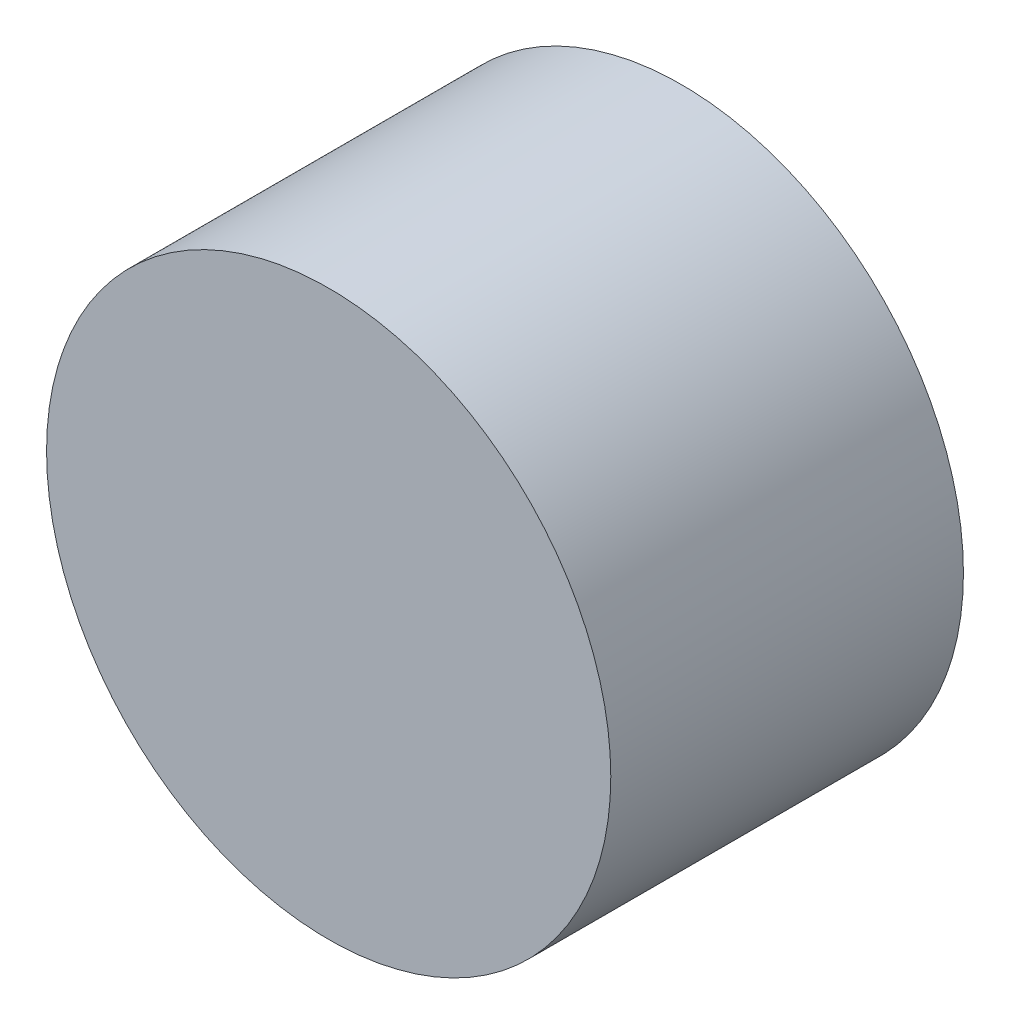
ISO-10303-21;
HEADER;
FILE_DESCRIPTION(('STEP AP214'),'2;1');
FILE_NAME('part.step','',(''),(''),'','','');
FILE_SCHEMA(('AUTOMOTIVE_DESIGN { 1 0 10303 214 1 1 1 1 }'));
ENDSEC;
DATA;
#1=APPLICATION_CONTEXT('core data for automotive mechanical design processes');
#2=APPLICATION_PROTOCOL_DEFINITION('international standard','automotive_design',2000,#1);
#3=PRODUCT_CONTEXT('',#1,'mechanical');
#4=PRODUCT('Part','Part','',(#3));
#5=PRODUCT_RELATED_PRODUCT_CATEGORY('part','',(#4));
#6=PRODUCT_DEFINITION_FORMATION('','',#4);
#7=PRODUCT_DEFINITION_CONTEXT('part definition',#1,'design');
#8=PRODUCT_DEFINITION('design','',#6,#7);
#9=PRODUCT_DEFINITION_SHAPE('','',#8);
#10=(LENGTH_UNIT() NAMED_UNIT(*) SI_UNIT(.MILLI.,.METRE.));
#11=(NAMED_UNIT(*) PLANE_ANGLE_UNIT() SI_UNIT($,.RADIAN.));
#12=(NAMED_UNIT(*) SI_UNIT($,.STERADIAN.) SOLID_ANGLE_UNIT());
#13=UNCERTAINTY_MEASURE_WITH_UNIT(LENGTH_MEASURE(1.E-05),#10,'distance_accuracy_value','');
#14=(GEOMETRIC_REPRESENTATION_CONTEXT(3) GLOBAL_UNCERTAINTY_ASSIGNED_CONTEXT((#13)) GLOBAL_UNIT_ASSIGNED_CONTEXT((#10,
#11,#12)) REPRESENTATION_CONTEXT('',''));
#15=CARTESIAN_POINT('',(0.,0.,0.));
#16=DIRECTION('',(0.,0.,1.));
#17=DIRECTION('',(1.,0.,0.));
#18=AXIS2_PLACEMENT_3D('',#15,#16,#17);
#19=CARTESIAN_POINT('',(0.,0.,0.));
#20=DIRECTION('',(0.,0.,1.));
#21=DIRECTION('',(1.,0.,0.));
#22=AXIS2_PLACEMENT_3D('',#19,#20,#21);
#23=PLANE('',#22);
#24=CARTESIAN_POINT('',(0.,0.,0.));
#25=DIRECTION('',(0.,0.,1.));
#26=DIRECTION('',(1.,0.,0.));
#27=AXIS2_PLACEMENT_3D('',#24,#25,#26);
#28=CIRCLE('',#27,20.);
#29=CARTESIAN_POINT('',(20.,0.,0.));
#30=VERTEX_POINT('',#29);
#31=EDGE_CURVE('E10',#30,#30,#28,.T.);
#32=ORIENTED_EDGE('',*,*,#31,.F.);
#33=EDGE_LOOP('',(#32));
#34=FACE_BOUND('',#33,.T.);
#35=CARTESIAN_POINT('',(0.,15.,0.));
#36=DIRECTION('',(0.,0.,1.));
#37=DIRECTION('',(1.,0.,0.));
#38=AXIS2_PLACEMENT_3D('',#35,#36,#37);
#39=CIRCLE('',#38,2.5);
#40=CARTESIAN_POINT('',(2.5,15.,0.));
#41=VERTEX_POINT('',#40);
#42=EDGE_CURVE('E48',#41,#41,#39,.T.);
#43=ORIENTED_EDGE('',*,*,#42,.T.);
#44=EDGE_LOOP('',(#43));
#45=FACE_BOUND('',#44,.T.);
#46=CARTESIAN_POINT('',(0.,5.,0.));
#47=DIRECTION('',(0.,0.,1.));
#48=DIRECTION('',(1.,0.,0.));
#49=AXIS2_PLACEMENT_3D('',#46,#47,#48);
#50=CIRCLE('',#49,2.5);
#51=CARTESIAN_POINT('',(2.5,5.,0.));
#52=VERTEX_POINT('',#51);
#53=EDGE_CURVE('E53',#52,#52,#50,.T.);
#54=ORIENTED_EDGE('',*,*,#53,.T.);
#55=EDGE_LOOP('',(#54));
#56=FACE_BOUND('',#55,.T.);
#57=CARTESIAN_POINT('',(10.6066017177984,10.6066017177987,0.));
#58=DIRECTION('',(0.,0.,1.));
#59=DIRECTION('',(1.,0.,0.));
#60=AXIS2_PLACEMENT_3D('',#57,#58,#59);
#61=CIRCLE('',#60,2.50000000000007);
#62=CARTESIAN_POINT('',(13.1066017177985,10.6066017177987,0.));
#63=VERTEX_POINT('',#62);
#64=EDGE_CURVE('E58',#63,#63,#61,.T.);
#65=ORIENTED_EDGE('',*,*,#64,.T.);
#66=EDGE_LOOP('',(#65));
#67=FACE_BOUND('',#66,.T.);
#68=CARTESIAN_POINT('',(15.0000000000006,6.37821527513228E-13,0.));
#69=DIRECTION('',(0.,0.,1.));
#70=DIRECTION('',(1.,0.,0.));
#71=AXIS2_PLACEMENT_3D('',#68,#69,#70);
#72=CIRCLE('',#71,2.50000000000047);
#73=CARTESIAN_POINT('',(17.5000000000011,6.37821527513228E-13,0.));
#74=VERTEX_POINT('',#73);
#75=EDGE_CURVE('E74',#74,#74,#72,.T.);
#76=ORIENTED_EDGE('',*,*,#75,.T.);
#77=EDGE_LOOP('',(#76));
#78=FACE_BOUND('',#77,.T.);
#79=CARTESIAN_POINT('',(10.6066017177993,-10.6066017177978,0.));
#80=DIRECTION('',(0.,0.,1.));
#81=DIRECTION('',(1.,0.,0.));
#82=AXIS2_PLACEMENT_3D('',#79,#80,#81);
#83=CIRCLE('',#82,2.50000000000098);
#84=CARTESIAN_POINT('',(13.1066017178003,-10.6066017177978,0.));
#85=VERTEX_POINT('',#84);
#86=EDGE_CURVE('E82',#85,#85,#83,.T.);
#87=ORIENTED_EDGE('',*,*,#86,.T.);
#88=EDGE_LOOP('',(#87));
#89=FACE_BOUND('',#88,.T.);
#90=CARTESIAN_POINT('',(1.27564305502646E-12,-15.,0.));
#91=DIRECTION('',(0.,0.,1.));
#92=DIRECTION('',(1.,0.,0.));
#93=AXIS2_PLACEMENT_3D('',#90,#91,#92);
#94=CIRCLE('',#93,2.50000000000132);
#95=CARTESIAN_POINT('',(2.50000000000259,-15.,0.));
#96=VERTEX_POINT('',#95);
#97=EDGE_CURVE('E90',#96,#96,#94,.T.);
#98=ORIENTED_EDGE('',*,*,#97,.T.);
#99=EDGE_LOOP('',(#98));
#100=FACE_BOUND('',#99,.T.);
#101=CARTESIAN_POINT('',(-10.6066017177971,-10.6066017177987,0.));
#102=DIRECTION('',(0.,0.,1.));
#103=DIRECTION('',(1.,0.,0.));
#104=AXIS2_PLACEMENT_3D('',#101,#102,#103);
#105=CIRCLE('',#104,2.5000000000013);
#106=CARTESIAN_POINT('',(-8.10660171779582,-10.6066017177987,0.));
#107=VERTEX_POINT('',#106);
#108=EDGE_CURVE('E98',#107,#107,#105,.T.);
#109=ORIENTED_EDGE('',*,*,#108,.T.);
#110=EDGE_LOOP('',(#109));
#111=FACE_BOUND('',#110,.T.);
#112=CARTESIAN_POINT('',(-14.9999999999994,-6.39658497711949E-13,0.));
#113=DIRECTION('',(0.,0.,1.));
#114=DIRECTION('',(1.,0.,0.));
#115=AXIS2_PLACEMENT_3D('',#112,#113,#114);
#116=CIRCLE('',#115,2.50000000000095);
#117=CARTESIAN_POINT('',(-12.4999999999984,-6.39658497711949E-13,0.));
#118=VERTEX_POINT('',#117);
#119=EDGE_CURVE('E106',#118,#118,#116,.T.);
#120=ORIENTED_EDGE('',*,*,#119,.T.);
#121=EDGE_LOOP('',(#120));
#122=FACE_BOUND('',#121,.T.);
#123=CARTESIAN_POINT('',(-10.606601717798,10.6066017177978,0.));
#124=DIRECTION('',(0.,0.,1.));
#125=DIRECTION('',(1.,0.,0.));
#126=AXIS2_PLACEMENT_3D('',#123,#124,#125);
#127=CIRCLE('',#126,2.50000000000049);
#128=CARTESIAN_POINT('',(-8.10660171779754,10.6066017177978,0.));
#129=VERTEX_POINT('',#128);
#130=EDGE_CURVE('E114',#129,#129,#127,.T.);
#131=ORIENTED_EDGE('',*,*,#130,.T.);
#132=EDGE_LOOP('',(#131));
#133=FACE_BOUND('',#132,.T.);
#134=CARTESIAN_POINT('',(5.,0.,0.));
#135=DIRECTION('',(0.,0.,1.));
#136=DIRECTION('',(1.,0.,0.));
#137=AXIS2_PLACEMENT_3D('',#134,#135,#136);
#138=CIRCLE('',#137,2.5);
#139=CARTESIAN_POINT('',(7.5,0.,0.));
#140=VERTEX_POINT('',#139);
#141=EDGE_CURVE('E122',#140,#140,#138,.T.);
#142=ORIENTED_EDGE('',*,*,#141,.T.);
#143=EDGE_LOOP('',(#142));
#144=FACE_BOUND('',#143,.T.);
#145=CARTESIAN_POINT('',(0.,-5.,0.));
#146=DIRECTION('',(0.,0.,1.));
#147=DIRECTION('',(1.,0.,0.));
#148=AXIS2_PLACEMENT_3D('',#145,#146,#147);
#149=CIRCLE('',#148,2.5);
#150=CARTESIAN_POINT('',(2.49999999999997,-5.,0.));
#151=VERTEX_POINT('',#150);
#152=EDGE_CURVE('E130',#151,#151,#149,.T.);
#153=ORIENTED_EDGE('',*,*,#152,.T.);
#154=EDGE_LOOP('',(#153));
#155=FACE_BOUND('',#154,.T.);
#156=CARTESIAN_POINT('',(-5.,0.,0.));
#157=DIRECTION('',(0.,0.,1.));
#158=DIRECTION('',(1.,0.,0.));
#159=AXIS2_PLACEMENT_3D('',#156,#157,#158);
#160=CIRCLE('',#159,2.5);
#161=CARTESIAN_POINT('',(-2.5,0.,0.));
#162=VERTEX_POINT('',#161);
#163=EDGE_CURVE('E138',#162,#162,#160,.T.);
#164=ORIENTED_EDGE('',*,*,#163,.T.);
#165=EDGE_LOOP('',(#164));
#166=FACE_BOUND('',#165,.T.);
#167=ADVANCED_FACE('F40',(#34,#45,#56,#67,#78,#89,#100,#111,#122,#133,#144,#155,#166),#23,.F.);
#168=CARTESIAN_POINT('',(0.,0.,10.));
#169=DIRECTION('',(0.,0.,-1.));
#170=DIRECTION('',(-1.,0.,0.));
#171=AXIS2_PLACEMENT_3D('',#168,#169,#170);
#172=CYLINDRICAL_SURFACE('',#171,20.);
#173=ORIENTED_EDGE('',*,*,#31,.T.);
#174=EDGE_LOOP('',(#173));
#175=FACE_BOUND('',#174,.T.);
#176=CARTESIAN_POINT('',(0.,0.,25.));
#177=DIRECTION('',(0.,0.,1.));
#178=DIRECTION('',(1.,0.,0.));
#179=AXIS2_PLACEMENT_3D('',#176,#177,#178);
#180=CIRCLE('',#179,20.);
#181=CARTESIAN_POINT('',(20.,0.,25.));
#182=VERTEX_POINT('',#181);
#183=EDGE_CURVE('E148',#182,#182,#180,.T.);
#184=ORIENTED_EDGE('',*,*,#183,.F.);
#185=EDGE_LOOP('',(#184));
#186=FACE_BOUND('',#185,.T.);
#187=ADVANCED_FACE('F42',(#175,#186),#172,.T.);
#188=CARTESIAN_POINT('',(0.,15.,10.));
#189=DIRECTION('',(0.,0.,-1.));
#190=DIRECTION('',(-1.,0.,0.));
#191=AXIS2_PLACEMENT_3D('',#188,#189,#190);
#192=CYLINDRICAL_SURFACE('',#191,2.5);
#193=CARTESIAN_POINT('',(0.,15.,10.));
#194=DIRECTION('',(0.,0.,1.));
#195=DIRECTION('',(1.,0.,0.));
#196=AXIS2_PLACEMENT_3D('',#193,#194,#195);
#197=CIRCLE('',#196,2.5);
#198=CARTESIAN_POINT('',(2.5,15.,10.));
#199=VERTEX_POINT('',#198);
#200=EDGE_CURVE('E61',#199,#199,#197,.T.);
#201=ORIENTED_EDGE('',*,*,#200,.T.);
#202=EDGE_LOOP('',(#201));
#203=FACE_BOUND('',#202,.T.);
#204=ORIENTED_EDGE('',*,*,#42,.F.);
#205=EDGE_LOOP('',(#204));
#206=FACE_BOUND('',#205,.T.);
#207=ADVANCED_FACE('F156',(#203,#206),#192,.F.);
#208=CARTESIAN_POINT('',(0.,5.,10.));
#209=DIRECTION('',(0.,0.,-1.));
#210=DIRECTION('',(-1.,0.,0.));
#211=AXIS2_PLACEMENT_3D('',#208,#209,#210);
#212=CYLINDRICAL_SURFACE('',#211,2.5);
#213=CARTESIAN_POINT('',(0.,5.,10.));
#214=DIRECTION('',(0.,0.,1.));
#215=DIRECTION('',(1.,0.,0.));
#216=AXIS2_PLACEMENT_3D('',#213,#214,#215);
#217=CIRCLE('',#216,2.5);
#218=CARTESIAN_POINT('',(2.5,5.,10.));
#219=VERTEX_POINT('',#218);
#220=EDGE_CURVE('E65',#219,#219,#217,.T.);
#221=ORIENTED_EDGE('',*,*,#220,.T.);
#222=EDGE_LOOP('',(#221));
#223=FACE_BOUND('',#222,.T.);
#224=ORIENTED_EDGE('',*,*,#53,.F.);
#225=EDGE_LOOP('',(#224));
#226=FACE_BOUND('',#225,.T.);
#227=ADVANCED_FACE('F162',(#223,#226),#212,.F.);
#228=CARTESIAN_POINT('',(10.6066017177984,10.6066017177987,10.));
#229=DIRECTION('',(0.,0.,-1.));
#230=DIRECTION('',(-1.,0.,0.));
#231=AXIS2_PLACEMENT_3D('',#228,#229,#230);
#232=CYLINDRICAL_SURFACE('',#231,2.50000000000007);
#233=CARTESIAN_POINT('',(10.6066017177984,10.6066017177987,10.));
#234=DIRECTION('',(0.,0.,1.));
#235=DIRECTION('',(1.,0.,0.));
#236=AXIS2_PLACEMENT_3D('',#233,#234,#235);
#237=CIRCLE('',#236,2.50000000000007);
#238=CARTESIAN_POINT('',(13.1066017177985,10.6066017177987,10.));
#239=VERTEX_POINT('',#238);
#240=EDGE_CURVE('E64',#239,#239,#237,.T.);
#241=ORIENTED_EDGE('',*,*,#240,.T.);
#242=EDGE_LOOP('',(#241));
#243=FACE_BOUND('',#242,.T.);
#244=ORIENTED_EDGE('',*,*,#64,.F.);
#245=EDGE_LOOP('',(#244));
#246=FACE_BOUND('',#245,.T.);
#247=ADVANCED_FACE('F172',(#243,#246),#232,.F.);
#248=CARTESIAN_POINT('',(15.0000000000006,6.37821527513228E-13,10.));
#249=DIRECTION('',(0.,0.,-1.));
#250=DIRECTION('',(-1.,0.,0.));
#251=AXIS2_PLACEMENT_3D('',#248,#249,#250);
#252=CYLINDRICAL_SURFACE('',#251,2.50000000000047);
#253=CARTESIAN_POINT('',(15.0000000000006,6.37821527513228E-13,10.));
#254=DIRECTION('',(0.,0.,1.));
#255=DIRECTION('',(1.,0.,0.));
#256=AXIS2_PLACEMENT_3D('',#253,#254,#255);
#257=CIRCLE('',#256,2.50000000000047);
#258=CARTESIAN_POINT('',(17.5000000000011,6.37821527513228E-13,10.));
#259=VERTEX_POINT('',#258);
#260=EDGE_CURVE('E70',#259,#259,#257,.T.);
#261=ORIENTED_EDGE('',*,*,#260,.T.);
#262=EDGE_LOOP('',(#261));
#263=FACE_BOUND('',#262,.T.);
#264=ORIENTED_EDGE('',*,*,#75,.F.);
#265=EDGE_LOOP('',(#264));
#266=FACE_BOUND('',#265,.T.);
#267=ADVANCED_FACE('F176',(#263,#266),#252,.F.);
#268=CARTESIAN_POINT('',(10.6066017177993,-10.6066017177978,10.));
#269=DIRECTION('',(0.,0.,-1.));
#270=DIRECTION('',(-1.,0.,0.));
#271=AXIS2_PLACEMENT_3D('',#268,#269,#270);
#272=CYLINDRICAL_SURFACE('',#271,2.50000000000098);
#273=CARTESIAN_POINT('',(10.6066017177993,-10.6066017177978,10.));
#274=DIRECTION('',(0.,0.,1.));
#275=DIRECTION('',(1.,0.,0.));
#276=AXIS2_PLACEMENT_3D('',#273,#274,#275);
#277=CIRCLE('',#276,2.50000000000098);
#278=CARTESIAN_POINT('',(13.1066017178003,-10.6066017177978,10.));
#279=VERTEX_POINT('',#278);
#280=EDGE_CURVE('E78',#279,#279,#277,.T.);
#281=ORIENTED_EDGE('',*,*,#280,.T.);
#282=EDGE_LOOP('',(#281));
#283=FACE_BOUND('',#282,.T.);
#284=ORIENTED_EDGE('',*,*,#86,.F.);
#285=EDGE_LOOP('',(#284));
#286=FACE_BOUND('',#285,.T.);
#287=ADVANCED_FACE('F180',(#283,#286),#272,.F.);
#288=CARTESIAN_POINT('',(1.27564305502646E-12,-15.,10.));
#289=DIRECTION('',(0.,0.,-1.));
#290=DIRECTION('',(-1.,0.,0.));
#291=AXIS2_PLACEMENT_3D('',#288,#289,#290);
#292=CYLINDRICAL_SURFACE('',#291,2.50000000000132);
#293=CARTESIAN_POINT('',(1.27564305502646E-12,-15.,10.));
#294=DIRECTION('',(0.,0.,1.));
#295=DIRECTION('',(1.,0.,0.));
#296=AXIS2_PLACEMENT_3D('',#293,#294,#295);
#297=CIRCLE('',#296,2.50000000000132);
#298=CARTESIAN_POINT('',(2.50000000000259,-15.,10.));
#299=VERTEX_POINT('',#298);
#300=EDGE_CURVE('E86',#299,#299,#297,.T.);
#301=ORIENTED_EDGE('',*,*,#300,.T.);
#302=EDGE_LOOP('',(#301));
#303=FACE_BOUND('',#302,.T.);
#304=ORIENTED_EDGE('',*,*,#97,.F.);
#305=EDGE_LOOP('',(#304));
#306=FACE_BOUND('',#305,.T.);
#307=ADVANCED_FACE('F184',(#303,#306),#292,.F.);
#308=CARTESIAN_POINT('',(-10.6066017177971,-10.6066017177987,10.));
#309=DIRECTION('',(0.,0.,-1.));
#310=DIRECTION('',(-1.,0.,0.));
#311=AXIS2_PLACEMENT_3D('',#308,#309,#310);
#312=CYLINDRICAL_SURFACE('',#311,2.5000000000013);
#313=CARTESIAN_POINT('',(-10.6066017177971,-10.6066017177987,10.));
#314=DIRECTION('',(0.,0.,1.));
#315=DIRECTION('',(1.,0.,0.));
#316=AXIS2_PLACEMENT_3D('',#313,#314,#315);
#317=CIRCLE('',#316,2.5000000000013);
#318=CARTESIAN_POINT('',(-8.10660171779582,-10.6066017177987,10.));
#319=VERTEX_POINT('',#318);
#320=EDGE_CURVE('E94',#319,#319,#317,.T.);
#321=ORIENTED_EDGE('',*,*,#320,.T.);
#322=EDGE_LOOP('',(#321));
#323=FACE_BOUND('',#322,.T.);
#324=ORIENTED_EDGE('',*,*,#108,.F.);
#325=EDGE_LOOP('',(#324));
#326=FACE_BOUND('',#325,.T.);
#327=ADVANCED_FACE('F188',(#323,#326),#312,.F.);
#328=CARTESIAN_POINT('',(-14.9999999999994,-6.39658497711949E-13,10.));
#329=DIRECTION('',(0.,0.,-1.));
#330=DIRECTION('',(-1.,0.,0.));
#331=AXIS2_PLACEMENT_3D('',#328,#329,#330);
#332=CYLINDRICAL_SURFACE('',#331,2.50000000000095);
#333=CARTESIAN_POINT('',(-14.9999999999994,-6.39658497711949E-13,10.));
#334=DIRECTION('',(0.,0.,1.));
#335=DIRECTION('',(1.,0.,0.));
#336=AXIS2_PLACEMENT_3D('',#333,#334,#335);
#337=CIRCLE('',#336,2.50000000000095);
#338=CARTESIAN_POINT('',(-12.4999999999984,-6.39658497711949E-13,10.));
#339=VERTEX_POINT('',#338);
#340=EDGE_CURVE('E102',#339,#339,#337,.T.);
#341=ORIENTED_EDGE('',*,*,#340,.T.);
#342=EDGE_LOOP('',(#341));
#343=FACE_BOUND('',#342,.T.);
#344=ORIENTED_EDGE('',*,*,#119,.F.);
#345=EDGE_LOOP('',(#344));
#346=FACE_BOUND('',#345,.T.);
#347=ADVANCED_FACE('F192',(#343,#346),#332,.F.);
#348=CARTESIAN_POINT('',(-10.606601717798,10.6066017177978,10.));
#349=DIRECTION('',(0.,0.,-1.));
#350=DIRECTION('',(-1.,0.,0.));
#351=AXIS2_PLACEMENT_3D('',#348,#349,#350);
#352=CYLINDRICAL_SURFACE('',#351,2.50000000000049);
#353=CARTESIAN_POINT('',(-10.606601717798,10.6066017177978,10.));
#354=DIRECTION('',(0.,0.,1.));
#355=DIRECTION('',(1.,0.,0.));
#356=AXIS2_PLACEMENT_3D('',#353,#354,#355);
#357=CIRCLE('',#356,2.50000000000049);
#358=CARTESIAN_POINT('',(-8.10660171779754,10.6066017177978,10.));
#359=VERTEX_POINT('',#358);
#360=EDGE_CURVE('E110',#359,#359,#357,.T.);
#361=ORIENTED_EDGE('',*,*,#360,.T.);
#362=EDGE_LOOP('',(#361));
#363=FACE_BOUND('',#362,.T.);
#364=ORIENTED_EDGE('',*,*,#130,.F.);
#365=EDGE_LOOP('',(#364));
#366=FACE_BOUND('',#365,.T.);
#367=ADVANCED_FACE('F196',(#363,#366),#352,.F.);
#368=CARTESIAN_POINT('',(5.,0.,10.));
#369=DIRECTION('',(0.,0.,-1.));
#370=DIRECTION('',(-1.,0.,0.));
#371=AXIS2_PLACEMENT_3D('',#368,#369,#370);
#372=CYLINDRICAL_SURFACE('',#371,2.5);
#373=CARTESIAN_POINT('',(5.,0.,10.));
#374=DIRECTION('',(0.,0.,1.));
#375=DIRECTION('',(1.,0.,0.));
#376=AXIS2_PLACEMENT_3D('',#373,#374,#375);
#377=CIRCLE('',#376,2.5);
#378=CARTESIAN_POINT('',(7.5,0.,10.));
#379=VERTEX_POINT('',#378);
#380=EDGE_CURVE('E118',#379,#379,#377,.T.);
#381=ORIENTED_EDGE('',*,*,#380,.T.);
#382=EDGE_LOOP('',(#381));
#383=FACE_BOUND('',#382,.T.);
#384=ORIENTED_EDGE('',*,*,#141,.F.);
#385=EDGE_LOOP('',(#384));
#386=FACE_BOUND('',#385,.T.);
#387=ADVANCED_FACE('F200',(#383,#386),#372,.F.);
#388=CARTESIAN_POINT('',(0.,-5.,10.));
#389=DIRECTION('',(0.,0.,-1.));
#390=DIRECTION('',(-1.,0.,0.));
#391=AXIS2_PLACEMENT_3D('',#388,#389,#390);
#392=CYLINDRICAL_SURFACE('',#391,2.5);
#393=CARTESIAN_POINT('',(0.,-5.,10.));
#394=DIRECTION('',(0.,0.,1.));
#395=DIRECTION('',(1.,0.,0.));
#396=AXIS2_PLACEMENT_3D('',#393,#394,#395);
#397=CIRCLE('',#396,2.5);
#398=CARTESIAN_POINT('',(2.49999999999997,-5.,10.));
#399=VERTEX_POINT('',#398);
#400=EDGE_CURVE('E126',#399,#399,#397,.T.);
#401=ORIENTED_EDGE('',*,*,#400,.T.);
#402=EDGE_LOOP('',(#401));
#403=FACE_BOUND('',#402,.T.);
#404=ORIENTED_EDGE('',*,*,#152,.F.);
#405=EDGE_LOOP('',(#404));
#406=FACE_BOUND('',#405,.T.);
#407=ADVANCED_FACE('F204',(#403,#406),#392,.F.);
#408=CARTESIAN_POINT('',(-5.,0.,10.));
#409=DIRECTION('',(0.,0.,-1.));
#410=DIRECTION('',(-1.,0.,0.));
#411=AXIS2_PLACEMENT_3D('',#408,#409,#410);
#412=CYLINDRICAL_SURFACE('',#411,2.5);
#413=CARTESIAN_POINT('',(-5.,0.,10.));
#414=DIRECTION('',(0.,0.,1.));
#415=DIRECTION('',(1.,0.,0.));
#416=AXIS2_PLACEMENT_3D('',#413,#414,#415);
#417=CIRCLE('',#416,2.5);
#418=CARTESIAN_POINT('',(-2.5,0.,10.));
#419=VERTEX_POINT('',#418);
#420=EDGE_CURVE('E134',#419,#419,#417,.T.);
#421=ORIENTED_EDGE('',*,*,#420,.T.);
#422=EDGE_LOOP('',(#421));
#423=FACE_BOUND('',#422,.T.);
#424=ORIENTED_EDGE('',*,*,#163,.F.);
#425=EDGE_LOOP('',(#424));
#426=FACE_BOUND('',#425,.T.);
#427=ADVANCED_FACE('F208',(#423,#426),#412,.F.);
#428=CARTESIAN_POINT('',(0.,0.,10.));
#429=DIRECTION('',(0.,0.,1.));
#430=DIRECTION('',(1.,0.,0.));
#431=AXIS2_PLACEMENT_3D('',#428,#429,#430);
#432=PLANE('',#431);
#433=ORIENTED_EDGE('',*,*,#420,.F.);
#434=EDGE_LOOP('',(#433));
#435=FACE_BOUND('',#434,.T.);
#436=ADVANCED_FACE('F211',(#435),#432,.F.);
#437=ORIENTED_EDGE('',*,*,#380,.F.);
#438=EDGE_LOOP('',(#437));
#439=FACE_BOUND('',#438,.T.);
#440=ADVANCED_FACE('F287',(#439),#432,.F.);
#441=ORIENTED_EDGE('',*,*,#340,.F.);
#442=EDGE_LOOP('',(#441));
#443=FACE_BOUND('',#442,.T.);
#444=ADVANCED_FACE('F280',(#443),#432,.F.);
#445=ORIENTED_EDGE('',*,*,#300,.F.);
#446=EDGE_LOOP('',(#445));
#447=FACE_BOUND('',#446,.T.);
#448=ADVANCED_FACE('F273',(#447),#432,.F.);
#449=ORIENTED_EDGE('',*,*,#260,.F.);
#450=EDGE_LOOP('',(#449));
#451=FACE_BOUND('',#450,.T.);
#452=ADVANCED_FACE('F266',(#451),#432,.F.);
#453=ORIENTED_EDGE('',*,*,#220,.F.);
#454=EDGE_LOOP('',(#453));
#455=FACE_BOUND('',#454,.T.);
#456=ADVANCED_FACE('F259',(#455),#432,.F.);
#457=ORIENTED_EDGE('',*,*,#200,.F.);
#458=EDGE_LOOP('',(#457));
#459=FACE_BOUND('',#458,.T.);
#460=ADVANCED_FACE('F252',(#459),#432,.F.);
#461=ORIENTED_EDGE('',*,*,#240,.F.);
#462=EDGE_LOOP('',(#461));
#463=FACE_BOUND('',#462,.T.);
#464=ADVANCED_FACE('F245',(#463),#432,.F.);
#465=ORIENTED_EDGE('',*,*,#280,.F.);
#466=EDGE_LOOP('',(#465));
#467=FACE_BOUND('',#466,.T.);
#468=ADVANCED_FACE('F238',(#467),#432,.F.);
#469=ORIENTED_EDGE('',*,*,#320,.F.);
#470=EDGE_LOOP('',(#469));
#471=FACE_BOUND('',#470,.T.);
#472=ADVANCED_FACE('F231',(#471),#432,.F.);
#473=ORIENTED_EDGE('',*,*,#360,.F.);
#474=EDGE_LOOP('',(#473));
#475=FACE_BOUND('',#474,.T.);
#476=ADVANCED_FACE('F216',(#475),#432,.F.);
#477=ORIENTED_EDGE('',*,*,#400,.F.);
#478=EDGE_LOOP('',(#477));
#479=FACE_BOUND('',#478,.T.);
#480=ADVANCED_FACE('F213',(#479),#432,.F.);
#481=CARTESIAN_POINT('',(0.,0.,25.));
#482=DIRECTION('',(0.,0.,1.));
#483=DIRECTION('',(1.,0.,0.));
#484=AXIS2_PLACEMENT_3D('',#481,#482,#483);
#485=PLANE('',#484);
#486=ORIENTED_EDGE('',*,*,#183,.T.);
#487=EDGE_LOOP('',(#486));
#488=FACE_BOUND('',#487,.T.);
#489=ADVANCED_FACE('F153',(#488),#485,.T.);
#490=CLOSED_SHELL('',(#167,#187,#207,#227,#247,#267,#287,#307,#327,#347,#367,#387,#407,#427,
#436,#440,#444,#448,#452,#456,#460,#464,#468,#472,#476,#480,#489));
#491=MANIFOLD_SOLID_BREP('B2',#490);
#492=ADVANCED_BREP_SHAPE_REPRESENTATION('',(#18,#491),#14);
#493=SHAPE_DEFINITION_REPRESENTATION(#9,#492);
ENDSEC;
END-ISO-10303-21;
